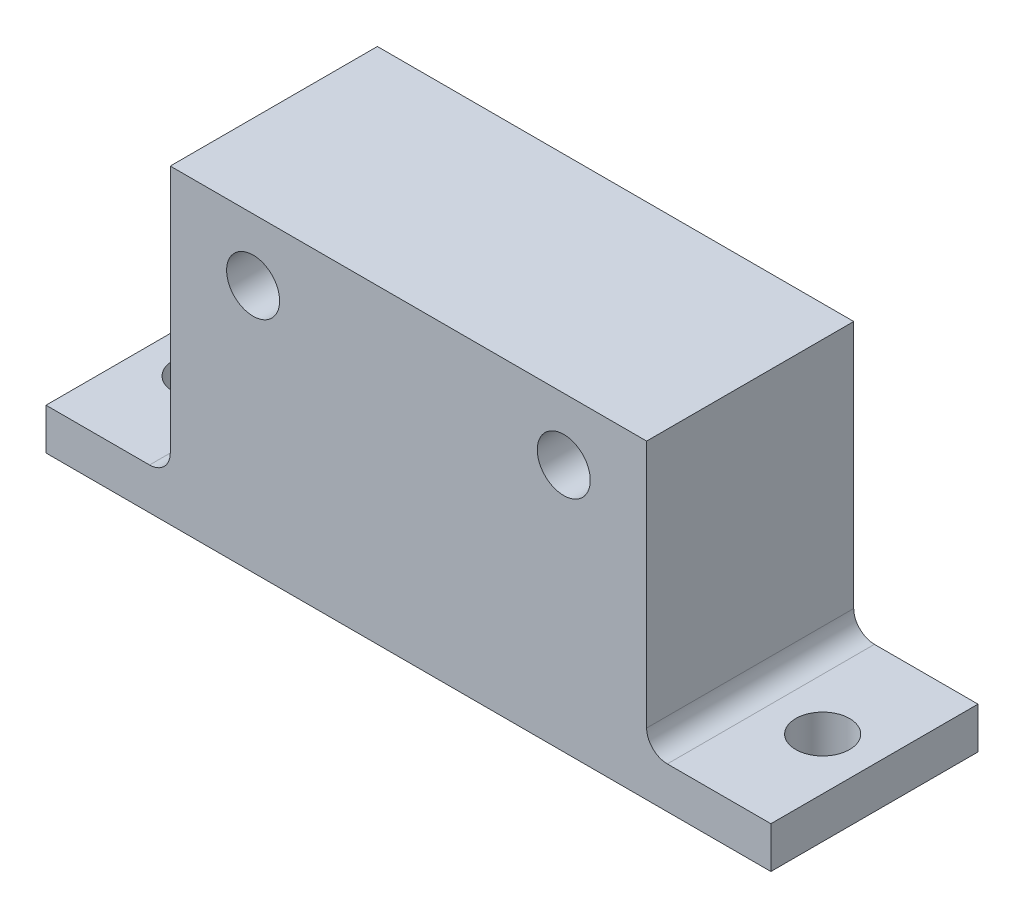
ISO-10303-21;
HEADER;
FILE_DESCRIPTION(('STEP AP214'),'2;1');
FILE_NAME('part.step','',(''),(''),'','','');
FILE_SCHEMA(('AUTOMOTIVE_DESIGN { 1 0 10303 214 1 1 1 1 }'));
ENDSEC;
DATA;
#1=APPLICATION_CONTEXT('core data for automotive mechanical design processes');
#2=APPLICATION_PROTOCOL_DEFINITION('international standard','automotive_design',2000,#1);
#3=PRODUCT_CONTEXT('',#1,'mechanical');
#4=PRODUCT('Part','Part','',(#3));
#5=PRODUCT_RELATED_PRODUCT_CATEGORY('part','',(#4));
#6=PRODUCT_DEFINITION_FORMATION('','',#4);
#7=PRODUCT_DEFINITION_CONTEXT('part definition',#1,'design');
#8=PRODUCT_DEFINITION('design','',#6,#7);
#9=PRODUCT_DEFINITION_SHAPE('','',#8);
#10=(LENGTH_UNIT() NAMED_UNIT(*) SI_UNIT(.MILLI.,.METRE.));
#11=(NAMED_UNIT(*) PLANE_ANGLE_UNIT() SI_UNIT($,.RADIAN.));
#12=(NAMED_UNIT(*) SI_UNIT($,.STERADIAN.) SOLID_ANGLE_UNIT());
#13=UNCERTAINTY_MEASURE_WITH_UNIT(LENGTH_MEASURE(1.E-05),#10,'distance_accuracy_value','');
#14=(GEOMETRIC_REPRESENTATION_CONTEXT(3) GLOBAL_UNCERTAINTY_ASSIGNED_CONTEXT((#13)) GLOBAL_UNIT_ASSIGNED_CONTEXT((#10,
#11,#12)) REPRESENTATION_CONTEXT('',''));
#15=CARTESIAN_POINT('',(0.,0.,0.));
#16=DIRECTION('',(0.,0.,1.));
#17=DIRECTION('',(1.,0.,0.));
#18=AXIS2_PLACEMENT_3D('',#15,#16,#17);
#19=CARTESIAN_POINT('',(22.225,-9.525,12.7));
#20=DIRECTION('',(-1.,0.,0.));
#21=DIRECTION('',(0.,0.,1.));
#22=AXIS2_PLACEMENT_3D('',#19,#20,#21);
#23=PLANE('',#22);
#24=DIRECTION('',(0.,1.,0.));
#25=VECTOR('',#24,1.);
#26=CARTESIAN_POINT('',(22.225,-9.525,0.));
#27=LINE('',#26,#25);
#28=CARTESIAN_POINT('',(22.225,-9.525,0.));
#29=VERTEX_POINT('',#28);
#30=CARTESIAN_POINT('',(22.225,-6.985,0.));
#31=VERTEX_POINT('',#30);
#32=EDGE_CURVE('E139',#29,#31,#27,.T.);
#33=ORIENTED_EDGE('',*,*,#32,.T.);
#34=DIRECTION('',(0.,0.,1.));
#35=VECTOR('',#34,1.);
#36=CARTESIAN_POINT('',(22.225,-6.985,0.));
#37=LINE('',#36,#35);
#38=CARTESIAN_POINT('',(22.225,-6.985,12.7));
#39=VERTEX_POINT('',#38);
#40=EDGE_CURVE('E182',#31,#39,#37,.T.);
#41=ORIENTED_EDGE('',*,*,#40,.T.);
#42=DIRECTION('',(0.,1.,0.));
#43=VECTOR('',#42,1.);
#44=CARTESIAN_POINT('',(22.225,-9.525,12.7));
#45=LINE('',#44,#43);
#46=CARTESIAN_POINT('',(22.225,-9.525,12.7));
#47=VERTEX_POINT('',#46);
#48=EDGE_CURVE('E136',#47,#39,#45,.T.);
#49=ORIENTED_EDGE('',*,*,#48,.F.);
#50=DIRECTION('',(0.,0.,-1.));
#51=VECTOR('',#50,1.);
#52=CARTESIAN_POINT('',(22.225,-9.525,12.7));
#53=LINE('',#52,#51);
#54=EDGE_CURVE('E143',#47,#29,#53,.T.);
#55=ORIENTED_EDGE('',*,*,#54,.T.);
#56=EDGE_LOOP('',(#33,#41,#49,#55));
#57=FACE_BOUND('',#56,.T.);
#58=ADVANCED_FACE('F32',(#57),#23,.F.);
#59=CARTESIAN_POINT('',(-22.225,9.525,12.7));
#60=DIRECTION('',(0.,-1.,0.));
#61=DIRECTION('',(0.,0.,-1.));
#62=AXIS2_PLACEMENT_3D('',#59,#60,#61);
#63=PLANE('',#62);
#64=DIRECTION('',(-1.,0.,0.));
#65=VECTOR('',#64,1.);
#66=CARTESIAN_POINT('',(-22.225,9.525,0.));
#67=LINE('',#66,#65);
#68=CARTESIAN_POINT('',(14.605,9.525,0.));
#69=VERTEX_POINT('',#68);
#70=CARTESIAN_POINT('',(-14.605,9.525,0.));
#71=VERTEX_POINT('',#70);
#72=EDGE_CURVE('E134',#69,#71,#67,.T.);
#73=ORIENTED_EDGE('',*,*,#72,.T.);
#74=DIRECTION('',(0.,0.,1.));
#75=VECTOR('',#74,1.);
#76=CARTESIAN_POINT('',(-14.605,9.525,0.));
#77=LINE('',#76,#75);
#78=CARTESIAN_POINT('',(-14.605,9.525,12.7));
#79=VERTEX_POINT('',#78);
#80=EDGE_CURVE('E128',#71,#79,#77,.T.);
#81=ORIENTED_EDGE('',*,*,#80,.T.);
#82=DIRECTION('',(-1.,0.,0.));
#83=VECTOR('',#82,1.);
#84=CARTESIAN_POINT('',(-22.225,9.525,12.7));
#85=LINE('',#84,#83);
#86=CARTESIAN_POINT('',(14.605,9.525,12.7));
#87=VERTEX_POINT('',#86);
#88=EDGE_CURVE('E188',#87,#79,#85,.T.);
#89=ORIENTED_EDGE('',*,*,#88,.F.);
#90=DIRECTION('',(0.,0.,1.));
#91=VECTOR('',#90,1.);
#92=CARTESIAN_POINT('',(14.605,9.525,0.));
#93=LINE('',#92,#91);
#94=EDGE_CURVE('E185',#69,#87,#93,.T.);
#95=ORIENTED_EDGE('',*,*,#94,.F.);
#96=EDGE_LOOP('',(#73,#81,#89,#95));
#97=FACE_BOUND('',#96,.T.);
#98=ADVANCED_FACE('F247',(#97),#63,.F.);
#99=CARTESIAN_POINT('',(-22.225,-9.525,12.7));
#100=DIRECTION('',(1.,0.,0.));
#101=DIRECTION('',(0.,0.,-1.));
#102=AXIS2_PLACEMENT_3D('',#99,#100,#101);
#103=PLANE('',#102);
#104=DIRECTION('',(0.,-1.,0.));
#105=VECTOR('',#104,1.);
#106=CARTESIAN_POINT('',(-22.225,-9.525,12.7));
#107=LINE('',#106,#105);
#108=CARTESIAN_POINT('',(-22.225,-6.985,12.7));
#109=VERTEX_POINT('',#108);
#110=CARTESIAN_POINT('',(-22.225,-9.525,12.7));
#111=VERTEX_POINT('',#110);
#112=EDGE_CURVE('E127',#109,#111,#107,.T.);
#113=ORIENTED_EDGE('',*,*,#112,.F.);
#114=DIRECTION('',(0.,0.,1.));
#115=VECTOR('',#114,1.);
#116=CARTESIAN_POINT('',(-22.225,-6.985,0.));
#117=LINE('',#116,#115);
#118=CARTESIAN_POINT('',(-22.225,-6.985,0.));
#119=VERTEX_POINT('',#118);
#120=EDGE_CURVE('E111',#119,#109,#117,.T.);
#121=ORIENTED_EDGE('',*,*,#120,.F.);
#122=DIRECTION('',(0.,-1.,0.));
#123=VECTOR('',#122,1.);
#124=CARTESIAN_POINT('',(-22.225,-9.525,0.));
#125=LINE('',#124,#123);
#126=CARTESIAN_POINT('',(-22.225,-9.525,0.));
#127=VERTEX_POINT('',#126);
#128=EDGE_CURVE('E125',#119,#127,#125,.T.);
#129=ORIENTED_EDGE('',*,*,#128,.T.);
#130=DIRECTION('',(0.,0.,-1.));
#131=VECTOR('',#130,1.);
#132=CARTESIAN_POINT('',(-22.225,-9.525,12.7));
#133=LINE('',#132,#131);
#134=EDGE_CURVE('E146',#111,#127,#133,.T.);
#135=ORIENTED_EDGE('',*,*,#134,.F.);
#136=EDGE_LOOP('',(#113,#121,#129,#135));
#137=FACE_BOUND('',#136,.T.);
#138=ADVANCED_FACE('F123',(#137),#103,.F.);
#139=CARTESIAN_POINT('',(-22.225,-9.525,12.7));
#140=DIRECTION('',(0.,1.,0.));
#141=DIRECTION('',(0.,0.,1.));
#142=AXIS2_PLACEMENT_3D('',#139,#140,#141);
#143=PLANE('',#142);
#144=CARTESIAN_POINT('',(19.05,-9.525,6.35));
#145=DIRECTION('',(0.,1.,0.));
#146=DIRECTION('',(0.,0.,1.));
#147=AXIS2_PLACEMENT_3D('',#144,#145,#146);
#148=CIRCLE('',#147,1.651);
#149=CARTESIAN_POINT('',(19.05,-9.525,8.001));
#150=VERTEX_POINT('',#149);
#151=EDGE_CURVE('E211',#150,#150,#148,.T.);
#152=ORIENTED_EDGE('',*,*,#151,.T.);
#153=EDGE_LOOP('',(#152));
#154=FACE_BOUND('',#153,.T.);
#155=CARTESIAN_POINT('',(-19.05,-9.525,6.4262));
#156=DIRECTION('',(0.,1.,0.));
#157=DIRECTION('',(0.,0.,1.));
#158=AXIS2_PLACEMENT_3D('',#155,#156,#157);
#159=CIRCLE('',#158,1.651);
#160=CARTESIAN_POINT('',(-19.05,-9.525,8.0772));
#161=VERTEX_POINT('',#160);
#162=EDGE_CURVE('E221',#161,#161,#159,.T.);
#163=ORIENTED_EDGE('',*,*,#162,.T.);
#164=EDGE_LOOP('',(#163));
#165=FACE_BOUND('',#164,.T.);
#166=DIRECTION('',(1.,0.,0.));
#167=VECTOR('',#166,1.);
#168=CARTESIAN_POINT('',(-22.225,-9.525,0.));
#169=LINE('',#168,#167);
#170=EDGE_CURVE('E133',#127,#29,#169,.T.);
#171=ORIENTED_EDGE('',*,*,#170,.T.);
#172=ORIENTED_EDGE('',*,*,#54,.F.);
#173=DIRECTION('',(1.,0.,0.));
#174=VECTOR('',#173,1.);
#175=CARTESIAN_POINT('',(-22.225,-9.525,12.7));
#176=LINE('',#175,#174);
#177=EDGE_CURVE('E147',#111,#47,#176,.T.);
#178=ORIENTED_EDGE('',*,*,#177,.F.);
#179=ORIENTED_EDGE('',*,*,#134,.T.);
#180=EDGE_LOOP('',(#171,#172,#178,#179));
#181=FACE_BOUND('',#180,.T.);
#182=ADVANCED_FACE('F203',(#154,#165,#181),#143,.F.);
#183=CARTESIAN_POINT('',(0.,0.,12.7));
#184=DIRECTION('',(0.,0.,-1.));
#185=DIRECTION('',(-1.,0.,0.));
#186=AXIS2_PLACEMENT_3D('',#183,#184,#185);
#187=PLANE('',#186);
#188=CARTESIAN_POINT('',(9.525,5.715,12.7));
#189=DIRECTION('',(0.,0.,-1.));
#190=DIRECTION('',(-1.,0.,0.));
#191=AXIS2_PLACEMENT_3D('',#188,#189,#190);
#192=CIRCLE('',#191,1.6256);
#193=CARTESIAN_POINT('',(7.8994,5.715,12.7));
#194=VERTEX_POINT('',#193);
#195=EDGE_CURVE('E178',#194,#194,#192,.T.);
#196=ORIENTED_EDGE('',*,*,#195,.T.);
#197=EDGE_LOOP('',(#196));
#198=FACE_BOUND('',#197,.T.);
#199=CARTESIAN_POINT('',(-9.525,5.715,12.7));
#200=DIRECTION('',(0.,0.,-1.));
#201=DIRECTION('',(-1.,0.,0.));
#202=AXIS2_PLACEMENT_3D('',#199,#200,#201);
#203=CIRCLE('',#202,1.6256);
#204=CARTESIAN_POINT('',(-11.1506,5.715,12.7));
#205=VERTEX_POINT('',#204);
#206=EDGE_CURVE('E210',#205,#205,#203,.T.);
#207=ORIENTED_EDGE('',*,*,#206,.T.);
#208=EDGE_LOOP('',(#207));
#209=FACE_BOUND('',#208,.T.);
#210=ORIENTED_EDGE('',*,*,#88,.T.);
#211=DIRECTION('',(0.,1.,0.));
#212=VECTOR('',#211,1.);
#213=CARTESIAN_POINT('',(-14.605,9.525,12.7));
#214=LINE('',#213,#212);
#215=CARTESIAN_POINT('',(-14.605,-5.715,12.7));
#216=VERTEX_POINT('',#215);
#217=EDGE_CURVE('E119',#216,#79,#214,.T.);
#218=ORIENTED_EDGE('',*,*,#217,.F.);
#219=CARTESIAN_POINT('',(-15.875,-5.715,12.7));
#220=DIRECTION('',(0.,0.,-1.));
#221=DIRECTION('',(-1.,0.,0.));
#222=AXIS2_PLACEMENT_3D('',#219,#220,#221);
#223=CIRCLE('',#222,1.27);
#224=CARTESIAN_POINT('',(-15.875,-6.985,12.7));
#225=VERTEX_POINT('',#224);
#226=EDGE_CURVE('E153',#216,#225,#223,.T.);
#227=ORIENTED_EDGE('',*,*,#226,.T.);
#228=DIRECTION('',(1.,0.,0.));
#229=VECTOR('',#228,1.);
#230=CARTESIAN_POINT('',(-22.225,-6.985,12.7));
#231=LINE('',#230,#229);
#232=EDGE_CURVE('E184',#109,#225,#231,.T.);
#233=ORIENTED_EDGE('',*,*,#232,.F.);
#234=ORIENTED_EDGE('',*,*,#112,.T.);
#235=ORIENTED_EDGE('',*,*,#177,.T.);
#236=ORIENTED_EDGE('',*,*,#48,.T.);
#237=DIRECTION('',(1.,0.,0.));
#238=VECTOR('',#237,1.);
#239=CARTESIAN_POINT('',(22.225,-6.985,12.7));
#240=LINE('',#239,#238);
#241=CARTESIAN_POINT('',(15.875,-6.985,12.7));
#242=VERTEX_POINT('',#241);
#243=EDGE_CURVE('E165',#242,#39,#240,.T.);
#244=ORIENTED_EDGE('',*,*,#243,.F.);
#245=CARTESIAN_POINT('',(15.875,-5.715,12.7));
#246=DIRECTION('',(0.,0.,-1.));
#247=DIRECTION('',(-1.,0.,0.));
#248=AXIS2_PLACEMENT_3D('',#245,#246,#247);
#249=CIRCLE('',#248,1.27);
#250=CARTESIAN_POINT('',(14.605,-5.715,12.7));
#251=VERTEX_POINT('',#250);
#252=EDGE_CURVE('E40',#242,#251,#249,.T.);
#253=ORIENTED_EDGE('',*,*,#252,.T.);
#254=DIRECTION('',(0.,-1.,0.));
#255=VECTOR('',#254,1.);
#256=CARTESIAN_POINT('',(14.605,9.525,12.7));
#257=LINE('',#256,#255);
#258=EDGE_CURVE('E175',#87,#251,#257,.T.);
#259=ORIENTED_EDGE('',*,*,#258,.F.);
#260=EDGE_LOOP('',(#210,#218,#227,#233,#234,#235,#236,#244,#253,#259));
#261=FACE_BOUND('',#260,.T.);
#262=ADVANCED_FACE('F172',(#198,#209,#261),#187,.F.);
#263=CARTESIAN_POINT('',(0.,0.,0.));
#264=DIRECTION('',(0.,0.,-1.));
#265=DIRECTION('',(-1.,0.,0.));
#266=AXIS2_PLACEMENT_3D('',#263,#264,#265);
#267=PLANE('',#266);
#268=CARTESIAN_POINT('',(9.525,5.715,0.));
#269=DIRECTION('',(0.,0.,-1.));
#270=DIRECTION('',(-1.,0.,0.));
#271=AXIS2_PLACEMENT_3D('',#268,#269,#270);
#272=CIRCLE('',#271,1.6256);
#273=CARTESIAN_POINT('',(7.8994,5.715,0.));
#274=VERTEX_POINT('',#273);
#275=EDGE_CURVE('E214',#274,#274,#272,.T.);
#276=ORIENTED_EDGE('',*,*,#275,.F.);
#277=EDGE_LOOP('',(#276));
#278=FACE_BOUND('',#277,.T.);
#279=CARTESIAN_POINT('',(-9.525,5.715,0.));
#280=DIRECTION('',(0.,0.,-1.));
#281=DIRECTION('',(-1.,0.,0.));
#282=AXIS2_PLACEMENT_3D('',#279,#280,#281);
#283=CIRCLE('',#282,1.6256);
#284=CARTESIAN_POINT('',(-11.1506,5.715,0.));
#285=VERTEX_POINT('',#284);
#286=EDGE_CURVE('E207',#285,#285,#283,.T.);
#287=ORIENTED_EDGE('',*,*,#286,.F.);
#288=EDGE_LOOP('',(#287));
#289=FACE_BOUND('',#288,.T.);
#290=DIRECTION('',(1.,0.,0.));
#291=VECTOR('',#290,1.);
#292=CARTESIAN_POINT('',(-22.225,-6.985,0.));
#293=LINE('',#292,#291);
#294=CARTESIAN_POINT('',(-15.875,-6.985,0.));
#295=VERTEX_POINT('',#294);
#296=EDGE_CURVE('E107',#119,#295,#293,.T.);
#297=ORIENTED_EDGE('',*,*,#296,.T.);
#298=CARTESIAN_POINT('',(-15.875,-5.715,0.));
#299=DIRECTION('',(0.,0.,-1.));
#300=DIRECTION('',(-1.,0.,0.));
#301=AXIS2_PLACEMENT_3D('',#298,#299,#300);
#302=CIRCLE('',#301,1.27);
#303=CARTESIAN_POINT('',(-14.605,-5.715,0.));
#304=VERTEX_POINT('',#303);
#305=EDGE_CURVE('E155',#295,#304,#302,.F.);
#306=ORIENTED_EDGE('',*,*,#305,.T.);
#307=DIRECTION('',(0.,1.,0.));
#308=VECTOR('',#307,1.);
#309=CARTESIAN_POINT('',(-14.605,9.525,0.));
#310=LINE('',#309,#308);
#311=EDGE_CURVE('E118',#304,#71,#310,.T.);
#312=ORIENTED_EDGE('',*,*,#311,.T.);
#313=ORIENTED_EDGE('',*,*,#72,.F.);
#314=DIRECTION('',(0.,-1.,0.));
#315=VECTOR('',#314,1.);
#316=CARTESIAN_POINT('',(14.605,9.525,0.));
#317=LINE('',#316,#315);
#318=CARTESIAN_POINT('',(14.605,-5.715,0.));
#319=VERTEX_POINT('',#318);
#320=EDGE_CURVE('E174',#69,#319,#317,.T.);
#321=ORIENTED_EDGE('',*,*,#320,.T.);
#322=CARTESIAN_POINT('',(15.875,-5.715,0.));
#323=DIRECTION('',(0.,0.,-1.));
#324=DIRECTION('',(-1.,0.,0.));
#325=AXIS2_PLACEMENT_3D('',#322,#323,#324);
#326=CIRCLE('',#325,1.27);
#327=CARTESIAN_POINT('',(15.875,-6.985,0.));
#328=VERTEX_POINT('',#327);
#329=EDGE_CURVE('E11',#319,#328,#326,.F.);
#330=ORIENTED_EDGE('',*,*,#329,.T.);
#331=DIRECTION('',(1.,0.,0.));
#332=VECTOR('',#331,1.);
#333=CARTESIAN_POINT('',(22.225,-6.985,0.));
#334=LINE('',#333,#332);
#335=EDGE_CURVE('E167',#328,#31,#334,.T.);
#336=ORIENTED_EDGE('',*,*,#335,.T.);
#337=ORIENTED_EDGE('',*,*,#32,.F.);
#338=ORIENTED_EDGE('',*,*,#170,.F.);
#339=ORIENTED_EDGE('',*,*,#128,.F.);
#340=EDGE_LOOP('',(#297,#306,#312,#313,#321,#330,#336,#337,#338,#339));
#341=FACE_BOUND('',#340,.T.);
#342=ADVANCED_FACE('F131',(#278,#289,#341),#267,.T.);
#343=CARTESIAN_POINT('',(22.225,-6.985,0.));
#344=DIRECTION('',(0.,-1.,0.));
#345=DIRECTION('',(1.,0.,0.));
#346=AXIS2_PLACEMENT_3D('',#343,#344,#345);
#347=PLANE('',#346);
#348=CARTESIAN_POINT('',(19.05,-6.985,6.35));
#349=DIRECTION('',(0.,1.,0.));
#350=DIRECTION('',(-1.,0.,0.));
#351=AXIS2_PLACEMENT_3D('',#348,#349,#350);
#352=CIRCLE('',#351,1.651);
#353=CARTESIAN_POINT('',(17.399,-6.985,6.35));
#354=VERTEX_POINT('',#353);
#355=EDGE_CURVE('E224',#354,#354,#352,.T.);
#356=ORIENTED_EDGE('',*,*,#355,.F.);
#357=EDGE_LOOP('',(#356));
#358=FACE_BOUND('',#357,.T.);
#359=ORIENTED_EDGE('',*,*,#335,.F.);
#360=DIRECTION('',(0.,0.,1.));
#361=VECTOR('',#360,1.);
#362=CARTESIAN_POINT('',(15.875,-6.985,12.7));
#363=LINE('',#362,#361);
#364=EDGE_CURVE('E157',#328,#242,#363,.T.);
#365=ORIENTED_EDGE('',*,*,#364,.T.);
#366=ORIENTED_EDGE('',*,*,#243,.T.);
#367=ORIENTED_EDGE('',*,*,#40,.F.);
#368=EDGE_LOOP('',(#359,#365,#366,#367));
#369=FACE_BOUND('',#368,.T.);
#370=ADVANCED_FACE('F163',(#358,#369),#347,.F.);
#371=CARTESIAN_POINT('',(14.605,9.525,0.));
#372=DIRECTION('',(-1.,0.,0.));
#373=DIRECTION('',(0.,-1.,0.));
#374=AXIS2_PLACEMENT_3D('',#371,#372,#373);
#375=PLANE('',#374);
#376=ORIENTED_EDGE('',*,*,#258,.T.);
#377=DIRECTION('',(0.,0.,1.));
#378=VECTOR('',#377,1.);
#379=CARTESIAN_POINT('',(14.605,-5.715,0.));
#380=LINE('',#379,#378);
#381=EDGE_CURVE('E47',#251,#319,#380,.F.);
#382=ORIENTED_EDGE('',*,*,#381,.T.);
#383=ORIENTED_EDGE('',*,*,#320,.F.);
#384=ORIENTED_EDGE('',*,*,#94,.T.);
#385=EDGE_LOOP('',(#376,#382,#383,#384));
#386=FACE_BOUND('',#385,.T.);
#387=ADVANCED_FACE('F235',(#386),#375,.F.);
#388=CARTESIAN_POINT('',(-14.605,9.525,0.));
#389=DIRECTION('',(1.,0.,0.));
#390=DIRECTION('',(0.,1.,0.));
#391=AXIS2_PLACEMENT_3D('',#388,#389,#390);
#392=PLANE('',#391);
#393=ORIENTED_EDGE('',*,*,#311,.F.);
#394=DIRECTION('',(0.,0.,1.));
#395=VECTOR('',#394,1.);
#396=CARTESIAN_POINT('',(-14.605,-5.715,12.7));
#397=LINE('',#396,#395);
#398=EDGE_CURVE('E149',#304,#216,#397,.T.);
#399=ORIENTED_EDGE('',*,*,#398,.T.);
#400=ORIENTED_EDGE('',*,*,#217,.T.);
#401=ORIENTED_EDGE('',*,*,#80,.F.);
#402=EDGE_LOOP('',(#393,#399,#400,#401));
#403=FACE_BOUND('',#402,.T.);
#404=ADVANCED_FACE('F241',(#403),#392,.F.);
#405=CARTESIAN_POINT('',(-22.225,-6.985,0.));
#406=DIRECTION('',(0.,-1.,0.));
#407=DIRECTION('',(0.,0.,-1.));
#408=AXIS2_PLACEMENT_3D('',#405,#406,#407);
#409=PLANE('',#408);
#410=CARTESIAN_POINT('',(-19.05,-6.98499999999999,6.4262));
#411=DIRECTION('',(0.,1.,0.));
#412=DIRECTION('',(-1.,0.,0.));
#413=AXIS2_PLACEMENT_3D('',#410,#411,#412);
#414=CIRCLE('',#413,1.651);
#415=CARTESIAN_POINT('',(-20.701,-6.98499999999999,6.4262));
#416=VERTEX_POINT('',#415);
#417=EDGE_CURVE('E225',#416,#416,#414,.T.);
#418=ORIENTED_EDGE('',*,*,#417,.F.);
#419=EDGE_LOOP('',(#418));
#420=FACE_BOUND('',#419,.T.);
#421=ORIENTED_EDGE('',*,*,#232,.T.);
#422=DIRECTION('',(0.,0.,1.));
#423=VECTOR('',#422,1.);
#424=CARTESIAN_POINT('',(-15.875,-6.985,0.));
#425=LINE('',#424,#423);
#426=EDGE_CURVE('E114',#225,#295,#425,.F.);
#427=ORIENTED_EDGE('',*,*,#426,.T.);
#428=ORIENTED_EDGE('',*,*,#296,.F.);
#429=ORIENTED_EDGE('',*,*,#120,.T.);
#430=EDGE_LOOP('',(#421,#427,#428,#429));
#431=FACE_BOUND('',#430,.T.);
#432=ADVANCED_FACE('F110',(#420,#431),#409,.F.);
#433=CARTESIAN_POINT('',(-15.875,-5.715,0.));
#434=DIRECTION('',(0.,0.,-1.));
#435=DIRECTION('',(-1.,0.,0.));
#436=AXIS2_PLACEMENT_3D('',#433,#434,#435);
#437=CYLINDRICAL_SURFACE('',#436,1.27);
#438=ORIENTED_EDGE('',*,*,#305,.F.);
#439=ORIENTED_EDGE('',*,*,#426,.F.);
#440=ORIENTED_EDGE('',*,*,#226,.F.);
#441=ORIENTED_EDGE('',*,*,#398,.F.);
#442=EDGE_LOOP('',(#438,#439,#440,#441));
#443=FACE_BOUND('',#442,.T.);
#444=ADVANCED_FACE('F254',(#443),#437,.F.);
#445=CARTESIAN_POINT('',(15.875,-5.715,0.));
#446=DIRECTION('',(0.,0.,-1.));
#447=DIRECTION('',(-1.,0.,0.));
#448=AXIS2_PLACEMENT_3D('',#445,#446,#447);
#449=CYLINDRICAL_SURFACE('',#448,1.27);
#450=ORIENTED_EDGE('',*,*,#329,.F.);
#451=ORIENTED_EDGE('',*,*,#381,.F.);
#452=ORIENTED_EDGE('',*,*,#252,.F.);
#453=ORIENTED_EDGE('',*,*,#364,.F.);
#454=EDGE_LOOP('',(#450,#451,#452,#453));
#455=FACE_BOUND('',#454,.T.);
#456=ADVANCED_FACE('F34',(#455),#449,.F.);
#457=CARTESIAN_POINT('',(-9.525,5.715,12.7));
#458=DIRECTION('',(0.,0.,-1.));
#459=DIRECTION('',(-1.,0.,0.));
#460=AXIS2_PLACEMENT_3D('',#457,#458,#459);
#461=CYLINDRICAL_SURFACE('',#460,1.6256);
#462=ORIENTED_EDGE('',*,*,#206,.F.);
#463=EDGE_LOOP('',(#462));
#464=FACE_BOUND('',#463,.T.);
#465=ORIENTED_EDGE('',*,*,#286,.T.);
#466=EDGE_LOOP('',(#465));
#467=FACE_BOUND('',#466,.T.);
#468=ADVANCED_FACE('F261',(#464,#467),#461,.F.);
#469=CARTESIAN_POINT('',(9.525,5.715,12.7));
#470=DIRECTION('',(0.,0.,-1.));
#471=DIRECTION('',(-1.,0.,0.));
#472=AXIS2_PLACEMENT_3D('',#469,#470,#471);
#473=CYLINDRICAL_SURFACE('',#472,1.6256);
#474=ORIENTED_EDGE('',*,*,#195,.F.);
#475=EDGE_LOOP('',(#474));
#476=FACE_BOUND('',#475,.T.);
#477=ORIENTED_EDGE('',*,*,#275,.T.);
#478=EDGE_LOOP('',(#477));
#479=FACE_BOUND('',#478,.T.);
#480=ADVANCED_FACE('F275',(#476,#479),#473,.F.);
#481=CARTESIAN_POINT('',(-19.05,-19.685,6.4262));
#482=DIRECTION('',(0.,1.,0.));
#483=DIRECTION('',(-1.,0.,0.));
#484=AXIS2_PLACEMENT_3D('',#481,#482,#483);
#485=CYLINDRICAL_SURFACE('',#484,1.651);
#486=ORIENTED_EDGE('',*,*,#417,.T.);
#487=EDGE_LOOP('',(#486));
#488=FACE_BOUND('',#487,.T.);
#489=ORIENTED_EDGE('',*,*,#162,.F.);
#490=EDGE_LOOP('',(#489));
#491=FACE_BOUND('',#490,.T.);
#492=ADVANCED_FACE('F279',(#488,#491),#485,.F.);
#493=CARTESIAN_POINT('',(19.05,-19.685,6.35));
#494=DIRECTION('',(0.,1.,0.));
#495=DIRECTION('',(-1.,0.,0.));
#496=AXIS2_PLACEMENT_3D('',#493,#494,#495);
#497=CYLINDRICAL_SURFACE('',#496,1.651);
#498=ORIENTED_EDGE('',*,*,#355,.T.);
#499=EDGE_LOOP('',(#498));
#500=FACE_BOUND('',#499,.T.);
#501=ORIENTED_EDGE('',*,*,#151,.F.);
#502=EDGE_LOOP('',(#501));
#503=FACE_BOUND('',#502,.T.);
#504=ADVANCED_FACE('F231',(#500,#503),#497,.F.);
#505=CLOSED_SHELL('',(#58,#98,#138,#182,#262,#342,#370,#387,#404,#432,#444,#456,#468,#480,#492,#504));
#506=MANIFOLD_SOLID_BREP('B2',#505);
#507=ADVANCED_BREP_SHAPE_REPRESENTATION('',(#18,#506),#14);
#508=SHAPE_DEFINITION_REPRESENTATION(#9,#507);
ENDSEC;
END-ISO-10303-21;
